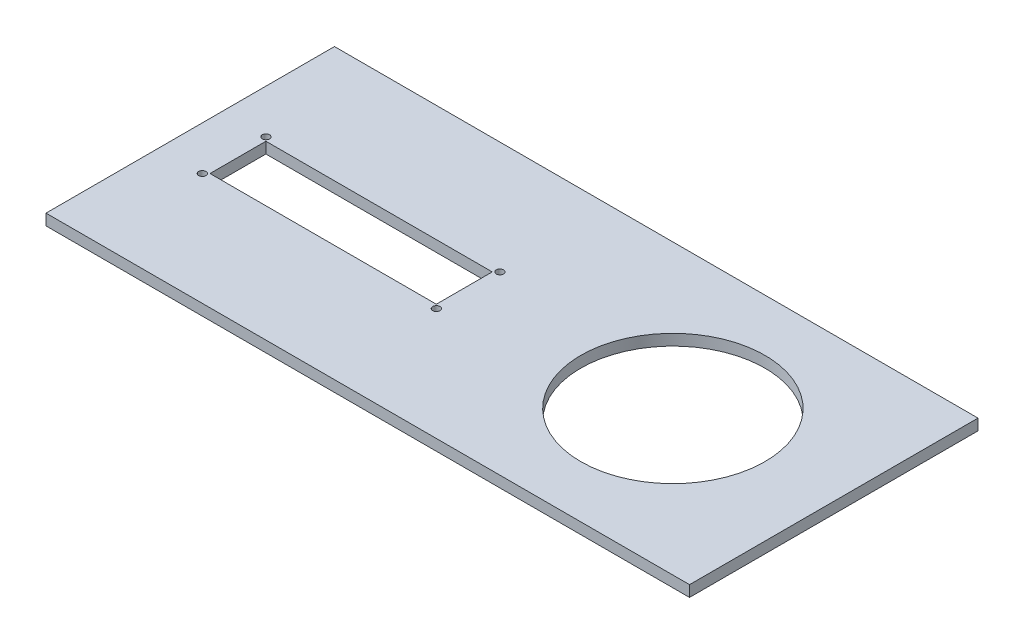
ISO-10303-21;
HEADER;
FILE_DESCRIPTION(('STEP AP214'),'2;1');
FILE_NAME('part.step','',(''),(''),'','','');
FILE_SCHEMA(('AUTOMOTIVE_DESIGN { 1 0 10303 214 1 1 1 1 }'));
ENDSEC;
DATA;
#1=APPLICATION_CONTEXT('core data for automotive mechanical design processes');
#2=APPLICATION_PROTOCOL_DEFINITION('international standard','automotive_design',2000,#1);
#3=PRODUCT_CONTEXT('',#1,'mechanical');
#4=PRODUCT('Part','Part','',(#3));
#5=PRODUCT_RELATED_PRODUCT_CATEGORY('part','',(#4));
#6=PRODUCT_DEFINITION_FORMATION('','',#4);
#7=PRODUCT_DEFINITION_CONTEXT('part definition',#1,'design');
#8=PRODUCT_DEFINITION('design','',#6,#7);
#9=PRODUCT_DEFINITION_SHAPE('','',#8);
#10=(LENGTH_UNIT() NAMED_UNIT(*) SI_UNIT(.MILLI.,.METRE.));
#11=(NAMED_UNIT(*) PLANE_ANGLE_UNIT() SI_UNIT($,.RADIAN.));
#12=(NAMED_UNIT(*) SI_UNIT($,.STERADIAN.) SOLID_ANGLE_UNIT());
#13=UNCERTAINTY_MEASURE_WITH_UNIT(LENGTH_MEASURE(1.E-05),#10,'distance_accuracy_value','');
#14=(GEOMETRIC_REPRESENTATION_CONTEXT(3) GLOBAL_UNCERTAINTY_ASSIGNED_CONTEXT((#13)) GLOBAL_UNIT_ASSIGNED_CONTEXT((#10,
#11,#12)) REPRESENTATION_CONTEXT('',''));
#15=CARTESIAN_POINT('',(0.,0.,0.));
#16=DIRECTION('',(0.,0.,1.));
#17=DIRECTION('',(1.,0.,0.));
#18=AXIS2_PLACEMENT_3D('',#15,#16,#17);
#19=CARTESIAN_POINT('',(184.15,6.35,82.55));
#20=DIRECTION('',(-1.,0.,0.));
#21=DIRECTION('',(0.,0.,1.));
#22=AXIS2_PLACEMENT_3D('',#19,#20,#21);
#23=PLANE('',#22);
#24=DIRECTION('',(0.,0.,-1.));
#25=VECTOR('',#24,1.);
#26=CARTESIAN_POINT('',(184.15,0.,82.55));
#27=LINE('',#26,#25);
#28=CARTESIAN_POINT('',(184.15,0.,82.55));
#29=VERTEX_POINT('',#28);
#30=CARTESIAN_POINT('',(184.15,0.,-82.55));
#31=VERTEX_POINT('',#30);
#32=EDGE_CURVE('E202',#29,#31,#27,.T.);
#33=ORIENTED_EDGE('',*,*,#32,.T.);
#34=DIRECTION('',(0.,-1.,0.));
#35=VECTOR('',#34,1.);
#36=CARTESIAN_POINT('',(184.15,6.35,-82.55));
#37=LINE('',#36,#35);
#38=CARTESIAN_POINT('',(184.15,6.35,-82.55));
#39=VERTEX_POINT('',#38);
#40=EDGE_CURVE('E12',#39,#31,#37,.T.);
#41=ORIENTED_EDGE('',*,*,#40,.F.);
#42=DIRECTION('',(0.,0.,-1.));
#43=VECTOR('',#42,1.);
#44=CARTESIAN_POINT('',(184.15,6.35,82.55));
#45=LINE('',#44,#43);
#46=CARTESIAN_POINT('',(184.15,6.35,82.55));
#47=VERTEX_POINT('',#46);
#48=EDGE_CURVE('E163',#47,#39,#45,.T.);
#49=ORIENTED_EDGE('',*,*,#48,.F.);
#50=DIRECTION('',(0.,-1.,0.));
#51=VECTOR('',#50,1.);
#52=CARTESIAN_POINT('',(184.15,6.35,82.55));
#53=LINE('',#52,#51);
#54=EDGE_CURVE('E221',#47,#29,#53,.T.);
#55=ORIENTED_EDGE('',*,*,#54,.T.);
#56=EDGE_LOOP('',(#33,#41,#49,#55));
#57=FACE_BOUND('',#56,.T.);
#58=ADVANCED_FACE('F38',(#57),#23,.F.);
#59=CARTESIAN_POINT('',(-184.15,6.35,-82.55));
#60=DIRECTION('',(0.,0.,1.));
#61=DIRECTION('',(1.,0.,0.));
#62=AXIS2_PLACEMENT_3D('',#59,#60,#61);
#63=PLANE('',#62);
#64=DIRECTION('',(-1.,0.,0.));
#65=VECTOR('',#64,1.);
#66=CARTESIAN_POINT('',(-184.15,0.,-82.55));
#67=LINE('',#66,#65);
#68=CARTESIAN_POINT('',(-184.15,0.,-82.55));
#69=VERTEX_POINT('',#68);
#70=EDGE_CURVE('E206',#31,#69,#67,.T.);
#71=ORIENTED_EDGE('',*,*,#70,.T.);
#72=DIRECTION('',(0.,-1.,0.));
#73=VECTOR('',#72,1.);
#74=CARTESIAN_POINT('',(-184.15,6.35,-82.55));
#75=LINE('',#74,#73);
#76=CARTESIAN_POINT('',(-184.15,6.35,-82.55));
#77=VERTEX_POINT('',#76);
#78=EDGE_CURVE('E45',#77,#69,#75,.T.);
#79=ORIENTED_EDGE('',*,*,#78,.F.);
#80=DIRECTION('',(-1.,0.,0.));
#81=VECTOR('',#80,1.);
#82=CARTESIAN_POINT('',(-184.15,6.35,-82.55));
#83=LINE('',#82,#81);
#84=EDGE_CURVE('E243',#39,#77,#83,.T.);
#85=ORIENTED_EDGE('',*,*,#84,.F.);
#86=ORIENTED_EDGE('',*,*,#40,.T.);
#87=EDGE_LOOP('',(#71,#79,#85,#86));
#88=FACE_BOUND('',#87,.T.);
#89=ADVANCED_FACE('F265',(#88),#63,.F.);
#90=CARTESIAN_POINT('',(-184.15,6.35,82.55));
#91=DIRECTION('',(1.,0.,0.));
#92=DIRECTION('',(0.,0.,-1.));
#93=AXIS2_PLACEMENT_3D('',#90,#91,#92);
#94=PLANE('',#93);
#95=DIRECTION('',(0.,0.,1.));
#96=VECTOR('',#95,1.);
#97=CARTESIAN_POINT('',(-184.15,0.,82.55));
#98=LINE('',#97,#96);
#99=CARTESIAN_POINT('',(-184.15,0.,82.55));
#100=VERTEX_POINT('',#99);
#101=EDGE_CURVE('E212',#69,#100,#98,.T.);
#102=ORIENTED_EDGE('',*,*,#101,.T.);
#103=DIRECTION('',(0.,-1.,0.));
#104=VECTOR('',#103,1.);
#105=CARTESIAN_POINT('',(-184.15,6.35,82.55));
#106=LINE('',#105,#104);
#107=CARTESIAN_POINT('',(-184.15,6.35,82.55));
#108=VERTEX_POINT('',#107);
#109=EDGE_CURVE('E223',#108,#100,#106,.T.);
#110=ORIENTED_EDGE('',*,*,#109,.F.);
#111=DIRECTION('',(0.,0.,1.));
#112=VECTOR('',#111,1.);
#113=CARTESIAN_POINT('',(-184.15,6.35,82.55));
#114=LINE('',#113,#112);
#115=EDGE_CURVE('E232',#77,#108,#114,.T.);
#116=ORIENTED_EDGE('',*,*,#115,.F.);
#117=ORIENTED_EDGE('',*,*,#78,.T.);
#118=EDGE_LOOP('',(#102,#110,#116,#117));
#119=FACE_BOUND('',#118,.T.);
#120=ADVANCED_FACE('F230',(#119),#94,.F.);
#121=CARTESIAN_POINT('',(-184.15,6.35,82.55));
#122=DIRECTION('',(0.,0.,-1.));
#123=DIRECTION('',(-1.,0.,0.));
#124=AXIS2_PLACEMENT_3D('',#121,#122,#123);
#125=PLANE('',#124);
#126=DIRECTION('',(1.,0.,0.));
#127=VECTOR('',#126,1.);
#128=CARTESIAN_POINT('',(-184.15,0.,82.55));
#129=LINE('',#128,#127);
#130=EDGE_CURVE('E219',#100,#29,#129,.T.);
#131=ORIENTED_EDGE('',*,*,#130,.T.);
#132=ORIENTED_EDGE('',*,*,#54,.F.);
#133=DIRECTION('',(1.,0.,0.));
#134=VECTOR('',#133,1.);
#135=CARTESIAN_POINT('',(-184.15,6.35,82.55));
#136=LINE('',#135,#134);
#137=EDGE_CURVE('E214',#108,#47,#136,.T.);
#138=ORIENTED_EDGE('',*,*,#137,.F.);
#139=ORIENTED_EDGE('',*,*,#109,.T.);
#140=EDGE_LOOP('',(#131,#132,#138,#139));
#141=FACE_BOUND('',#140,.T.);
#142=ADVANCED_FACE('F238',(#141),#125,.F.);
#143=CARTESIAN_POINT('',(0.,6.35,0.));
#144=DIRECTION('',(0.,-1.,0.));
#145=DIRECTION('',(0.,0.,-1.));
#146=AXIS2_PLACEMENT_3D('',#143,#144,#145);
#147=PLANE('',#146);
#148=CARTESIAN_POINT('',(92.075,6.35,0.));
#149=DIRECTION('',(0.,1.,0.));
#150=DIRECTION('',(0.,0.,1.));
#151=AXIS2_PLACEMENT_3D('',#148,#149,#150);
#152=CIRCLE('',#151,52.705);
#153=CARTESIAN_POINT('',(92.075,6.35,52.705));
#154=VERTEX_POINT('',#153);
#155=EDGE_CURVE('E151',#154,#154,#152,.T.);
#156=ORIENTED_EDGE('',*,*,#155,.F.);
#157=EDGE_LOOP('',(#156));
#158=FACE_BOUND('',#157,.T.);
#159=CARTESIAN_POINT('',(-25.1206,6.35,18.1864));
#160=DIRECTION('',(0.,1.,0.));
#161=DIRECTION('',(0.,0.,1.));
#162=AXIS2_PLACEMENT_3D('',#159,#160,#161);
#163=CIRCLE('',#162,2.08280000000001);
#164=CARTESIAN_POINT('',(-25.1206,6.35,20.2692));
#165=VERTEX_POINT('',#164);
#166=EDGE_CURVE('E187',#165,#165,#163,.T.);
#167=ORIENTED_EDGE('',*,*,#166,.F.);
#168=EDGE_LOOP('',(#167));
#169=FACE_BOUND('',#168,.T.);
#170=DIRECTION('',(-1.,0.,0.));
#171=VECTOR('',#170,1.);
#172=CARTESIAN_POINT('',(-156.845,6.35,-16.002));
#173=LINE('',#172,#171);
#174=CARTESIAN_POINT('',(-27.305,6.35,-16.002));
#175=VERTEX_POINT('',#174);
#176=CARTESIAN_POINT('',(-156.845,6.35,-16.002));
#177=VERTEX_POINT('',#176);
#178=EDGE_CURVE('E136',#175,#177,#173,.T.);
#179=ORIENTED_EDGE('',*,*,#178,.F.);
#180=DIRECTION('',(0.,0.,-1.));
#181=VECTOR('',#180,1.);
#182=CARTESIAN_POINT('',(-27.305,6.35,-16.002));
#183=LINE('',#182,#181);
#184=CARTESIAN_POINT('',(-27.305,6.35,16.002));
#185=VERTEX_POINT('',#184);
#186=EDGE_CURVE('E52',#185,#175,#183,.T.);
#187=ORIENTED_EDGE('',*,*,#186,.F.);
#188=DIRECTION('',(1.,0.,0.));
#189=VECTOR('',#188,1.);
#190=CARTESIAN_POINT('',(-156.845,6.35,16.002));
#191=LINE('',#190,#189);
#192=CARTESIAN_POINT('',(-156.845,6.35,16.002));
#193=VERTEX_POINT('',#192);
#194=EDGE_CURVE('E120',#193,#185,#191,.T.);
#195=ORIENTED_EDGE('',*,*,#194,.F.);
#196=DIRECTION('',(0.,0.,1.));
#197=VECTOR('',#196,1.);
#198=CARTESIAN_POINT('',(-156.845,6.35,-16.002));
#199=LINE('',#198,#197);
#200=EDGE_CURVE('E124',#177,#193,#199,.T.);
#201=ORIENTED_EDGE('',*,*,#200,.F.);
#202=EDGE_LOOP('',(#179,#187,#195,#201));
#203=FACE_BOUND('',#202,.T.);
#204=CARTESIAN_POINT('',(-159.0294,6.35,-18.1864));
#205=DIRECTION('',(0.,1.,0.));
#206=DIRECTION('',(0.,0.,1.));
#207=AXIS2_PLACEMENT_3D('',#204,#205,#206);
#208=CIRCLE('',#207,2.08279999999996);
#209=CARTESIAN_POINT('',(-159.0294,6.35,-16.1036));
#210=VERTEX_POINT('',#209);
#211=EDGE_CURVE('E157',#210,#210,#208,.T.);
#212=ORIENTED_EDGE('',*,*,#211,.F.);
#213=EDGE_LOOP('',(#212));
#214=FACE_BOUND('',#213,.T.);
#215=CARTESIAN_POINT('',(-159.0294,6.35,18.1864));
#216=DIRECTION('',(0.,1.,0.));
#217=DIRECTION('',(0.,0.,-1.));
#218=AXIS2_PLACEMENT_3D('',#215,#216,#217);
#219=CIRCLE('',#218,2.08279999999996);
#220=CARTESIAN_POINT('',(-159.0294,6.35,16.1036000000001));
#221=VERTEX_POINT('',#220);
#222=EDGE_CURVE('E170',#221,#221,#219,.T.);
#223=ORIENTED_EDGE('',*,*,#222,.F.);
#224=EDGE_LOOP('',(#223));
#225=FACE_BOUND('',#224,.T.);
#226=CARTESIAN_POINT('',(-25.1206,6.35,-18.1864));
#227=DIRECTION('',(0.,1.,0.));
#228=DIRECTION('',(0.,0.,-1.));
#229=AXIS2_PLACEMENT_3D('',#226,#227,#228);
#230=CIRCLE('',#229,2.08280000000002);
#231=CARTESIAN_POINT('',(-25.1206,6.35,-20.2692));
#232=VERTEX_POINT('',#231);
#233=EDGE_CURVE('E127',#232,#232,#230,.T.);
#234=ORIENTED_EDGE('',*,*,#233,.F.);
#235=EDGE_LOOP('',(#234));
#236=FACE_BOUND('',#235,.T.);
#237=ORIENTED_EDGE('',*,*,#48,.T.);
#238=ORIENTED_EDGE('',*,*,#84,.T.);
#239=ORIENTED_EDGE('',*,*,#115,.T.);
#240=ORIENTED_EDGE('',*,*,#137,.T.);
#241=EDGE_LOOP('',(#237,#238,#239,#240));
#242=FACE_BOUND('',#241,.T.);
#243=ADVANCED_FACE('F250',(#158,#169,#203,#214,#225,#236,#242),#147,.F.);
#244=CARTESIAN_POINT('',(0.,0.,0.));
#245=DIRECTION('',(0.,-1.,0.));
#246=DIRECTION('',(0.,0.,-1.));
#247=AXIS2_PLACEMENT_3D('',#244,#245,#246);
#248=PLANE('',#247);
#249=CARTESIAN_POINT('',(92.075,0.,0.));
#250=DIRECTION('',(0.,1.,0.));
#251=DIRECTION('',(0.,0.,1.));
#252=AXIS2_PLACEMENT_3D('',#249,#250,#251);
#253=CIRCLE('',#252,52.705);
#254=CARTESIAN_POINT('',(92.075,0.,52.705));
#255=VERTEX_POINT('',#254);
#256=EDGE_CURVE('E200',#255,#255,#253,.T.);
#257=ORIENTED_EDGE('',*,*,#256,.T.);
#258=EDGE_LOOP('',(#257));
#259=FACE_BOUND('',#258,.T.);
#260=CARTESIAN_POINT('',(-25.1206,0.,18.1864));
#261=DIRECTION('',(0.,1.,0.));
#262=DIRECTION('',(0.,0.,1.));
#263=AXIS2_PLACEMENT_3D('',#260,#261,#262);
#264=CIRCLE('',#263,2.08280000000001);
#265=CARTESIAN_POINT('',(-25.1206,0.,20.2692));
#266=VERTEX_POINT('',#265);
#267=EDGE_CURVE('E182',#266,#266,#264,.T.);
#268=ORIENTED_EDGE('',*,*,#267,.T.);
#269=EDGE_LOOP('',(#268));
#270=FACE_BOUND('',#269,.T.);
#271=DIRECTION('',(0.,0.,-1.));
#272=VECTOR('',#271,1.);
#273=CARTESIAN_POINT('',(-27.305,0.,-16.002));
#274=LINE('',#273,#272);
#275=CARTESIAN_POINT('',(-27.305,0.,16.002));
#276=VERTEX_POINT('',#275);
#277=CARTESIAN_POINT('',(-27.305,0.,-16.002));
#278=VERTEX_POINT('',#277);
#279=EDGE_CURVE('E104',#276,#278,#274,.T.);
#280=ORIENTED_EDGE('',*,*,#279,.T.);
#281=DIRECTION('',(-1.,0.,0.));
#282=VECTOR('',#281,1.);
#283=CARTESIAN_POINT('',(-156.845,0.,-16.002));
#284=LINE('',#283,#282);
#285=CARTESIAN_POINT('',(-156.845,0.,-16.002));
#286=VERTEX_POINT('',#285);
#287=EDGE_CURVE('E113',#278,#286,#284,.T.);
#288=ORIENTED_EDGE('',*,*,#287,.T.);
#289=DIRECTION('',(0.,0.,1.));
#290=VECTOR('',#289,1.);
#291=CARTESIAN_POINT('',(-156.845,0.,-16.002));
#292=LINE('',#291,#290);
#293=CARTESIAN_POINT('',(-156.845,0.,16.002));
#294=VERTEX_POINT('',#293);
#295=EDGE_CURVE('E60',#286,#294,#292,.T.);
#296=ORIENTED_EDGE('',*,*,#295,.T.);
#297=DIRECTION('',(1.,0.,0.));
#298=VECTOR('',#297,1.);
#299=CARTESIAN_POINT('',(-156.845,0.,16.002));
#300=LINE('',#299,#298);
#301=EDGE_CURVE('E110',#294,#276,#300,.T.);
#302=ORIENTED_EDGE('',*,*,#301,.T.);
#303=EDGE_LOOP('',(#280,#288,#296,#302));
#304=FACE_BOUND('',#303,.T.);
#305=CARTESIAN_POINT('',(-159.0294,0.,-18.1864));
#306=DIRECTION('',(0.,1.,0.));
#307=DIRECTION('',(0.,0.,1.));
#308=AXIS2_PLACEMENT_3D('',#305,#306,#307);
#309=CIRCLE('',#308,2.08279999999996);
#310=CARTESIAN_POINT('',(-159.0294,0.,-16.1036));
#311=VERTEX_POINT('',#310);
#312=EDGE_CURVE('E137',#311,#311,#309,.T.);
#313=ORIENTED_EDGE('',*,*,#312,.T.);
#314=EDGE_LOOP('',(#313));
#315=FACE_BOUND('',#314,.T.);
#316=CARTESIAN_POINT('',(-159.0294,0.,18.1864));
#317=DIRECTION('',(0.,1.,0.));
#318=DIRECTION('',(0.,0.,-1.));
#319=AXIS2_PLACEMENT_3D('',#316,#317,#318);
#320=CIRCLE('',#319,2.08279999999996);
#321=CARTESIAN_POINT('',(-159.0294,0.,16.1036000000001));
#322=VERTEX_POINT('',#321);
#323=EDGE_CURVE('E162',#322,#322,#320,.T.);
#324=ORIENTED_EDGE('',*,*,#323,.T.);
#325=EDGE_LOOP('',(#324));
#326=FACE_BOUND('',#325,.T.);
#327=CARTESIAN_POINT('',(-25.1206,0.,-18.1864));
#328=DIRECTION('',(0.,1.,0.));
#329=DIRECTION('',(0.,0.,-1.));
#330=AXIS2_PLACEMENT_3D('',#327,#328,#329);
#331=CIRCLE('',#330,2.08280000000002);
#332=CARTESIAN_POINT('',(-25.1206,0.,-20.2692));
#333=VERTEX_POINT('',#332);
#334=EDGE_CURVE('E175',#333,#333,#331,.T.);
#335=ORIENTED_EDGE('',*,*,#334,.T.);
#336=EDGE_LOOP('',(#335));
#337=FACE_BOUND('',#336,.T.);
#338=ORIENTED_EDGE('',*,*,#32,.F.);
#339=ORIENTED_EDGE('',*,*,#130,.F.);
#340=ORIENTED_EDGE('',*,*,#101,.F.);
#341=ORIENTED_EDGE('',*,*,#70,.F.);
#342=EDGE_LOOP('',(#338,#339,#340,#341));
#343=FACE_BOUND('',#342,.T.);
#344=ADVANCED_FACE('F117',(#259,#270,#304,#315,#326,#337,#343),#248,.T.);
#345=CARTESIAN_POINT('',(-25.1206,0.,-18.1864));
#346=DIRECTION('',(0.,1.,0.));
#347=DIRECTION('',(0.,0.,1.));
#348=AXIS2_PLACEMENT_3D('',#345,#346,#347);
#349=CYLINDRICAL_SURFACE('',#348,2.08280000000002);
#350=ORIENTED_EDGE('',*,*,#334,.F.);
#351=EDGE_LOOP('',(#350));
#352=FACE_BOUND('',#351,.T.);
#353=ORIENTED_EDGE('',*,*,#233,.T.);
#354=EDGE_LOOP('',(#353));
#355=FACE_BOUND('',#354,.T.);
#356=ADVANCED_FACE('F258',(#352,#355),#349,.F.);
#357=CARTESIAN_POINT('',(-159.0294,0.,18.1864));
#358=DIRECTION('',(0.,1.,0.));
#359=DIRECTION('',(0.,0.,1.));
#360=AXIS2_PLACEMENT_3D('',#357,#358,#359);
#361=CYLINDRICAL_SURFACE('',#360,2.08279999999996);
#362=ORIENTED_EDGE('',*,*,#323,.F.);
#363=EDGE_LOOP('',(#362));
#364=FACE_BOUND('',#363,.T.);
#365=ORIENTED_EDGE('',*,*,#222,.T.);
#366=EDGE_LOOP('',(#365));
#367=FACE_BOUND('',#366,.T.);
#368=ADVANCED_FACE('F298',(#364,#367),#361,.F.);
#369=CARTESIAN_POINT('',(-159.0294,0.,-18.1864));
#370=DIRECTION('',(0.,1.,0.));
#371=DIRECTION('',(0.,0.,1.));
#372=AXIS2_PLACEMENT_3D('',#369,#370,#371);
#373=CYLINDRICAL_SURFACE('',#372,2.08279999999996);
#374=ORIENTED_EDGE('',*,*,#312,.F.);
#375=EDGE_LOOP('',(#374));
#376=FACE_BOUND('',#375,.T.);
#377=ORIENTED_EDGE('',*,*,#211,.T.);
#378=EDGE_LOOP('',(#377));
#379=FACE_BOUND('',#378,.T.);
#380=ADVANCED_FACE('F308',(#376,#379),#373,.F.);
#381=CARTESIAN_POINT('',(-27.305,0.,-16.002));
#382=DIRECTION('',(1.,0.,0.));
#383=DIRECTION('',(0.,0.,-1.));
#384=AXIS2_PLACEMENT_3D('',#381,#382,#383);
#385=PLANE('',#384);
#386=ORIENTED_EDGE('',*,*,#186,.T.);
#387=DIRECTION('',(0.,1.,0.));
#388=VECTOR('',#387,1.);
#389=CARTESIAN_POINT('',(-27.305,0.,-16.002));
#390=LINE('',#389,#388);
#391=EDGE_CURVE('E100',#278,#175,#390,.T.);
#392=ORIENTED_EDGE('',*,*,#391,.F.);
#393=ORIENTED_EDGE('',*,*,#279,.F.);
#394=DIRECTION('',(0.,1.,0.));
#395=VECTOR('',#394,1.);
#396=CARTESIAN_POINT('',(-27.305,0.,16.002));
#397=LINE('',#396,#395);
#398=EDGE_CURVE('E149',#276,#185,#397,.T.);
#399=ORIENTED_EDGE('',*,*,#398,.T.);
#400=EDGE_LOOP('',(#386,#392,#393,#399));
#401=FACE_BOUND('',#400,.T.);
#402=ADVANCED_FACE('F102',(#401),#385,.F.);
#403=CARTESIAN_POINT('',(-156.845,0.,16.002));
#404=DIRECTION('',(0.,0.,1.));
#405=DIRECTION('',(1.,0.,0.));
#406=AXIS2_PLACEMENT_3D('',#403,#404,#405);
#407=PLANE('',#406);
#408=ORIENTED_EDGE('',*,*,#194,.T.);
#409=ORIENTED_EDGE('',*,*,#398,.F.);
#410=ORIENTED_EDGE('',*,*,#301,.F.);
#411=DIRECTION('',(0.,1.,0.));
#412=VECTOR('',#411,1.);
#413=CARTESIAN_POINT('',(-156.845,0.,16.002));
#414=LINE('',#413,#412);
#415=EDGE_CURVE('E152',#294,#193,#414,.T.);
#416=ORIENTED_EDGE('',*,*,#415,.T.);
#417=EDGE_LOOP('',(#408,#409,#410,#416));
#418=FACE_BOUND('',#417,.T.);
#419=ADVANCED_FACE('F326',(#418),#407,.F.);
#420=CARTESIAN_POINT('',(-156.845,0.,-16.002));
#421=DIRECTION('',(-1.,0.,0.));
#422=DIRECTION('',(0.,0.,1.));
#423=AXIS2_PLACEMENT_3D('',#420,#421,#422);
#424=PLANE('',#423);
#425=ORIENTED_EDGE('',*,*,#200,.T.);
#426=ORIENTED_EDGE('',*,*,#415,.F.);
#427=ORIENTED_EDGE('',*,*,#295,.F.);
#428=DIRECTION('',(0.,1.,0.));
#429=VECTOR('',#428,1.);
#430=CARTESIAN_POINT('',(-156.845,0.,-16.002));
#431=LINE('',#430,#429);
#432=EDGE_CURVE('E109',#286,#177,#431,.T.);
#433=ORIENTED_EDGE('',*,*,#432,.T.);
#434=EDGE_LOOP('',(#425,#426,#427,#433));
#435=FACE_BOUND('',#434,.T.);
#436=ADVANCED_FACE('F335',(#435),#424,.F.);
#437=CARTESIAN_POINT('',(-156.845,0.,-16.002));
#438=DIRECTION('',(0.,0.,-1.));
#439=DIRECTION('',(-1.,0.,0.));
#440=AXIS2_PLACEMENT_3D('',#437,#438,#439);
#441=PLANE('',#440);
#442=ORIENTED_EDGE('',*,*,#178,.T.);
#443=ORIENTED_EDGE('',*,*,#432,.F.);
#444=ORIENTED_EDGE('',*,*,#287,.F.);
#445=ORIENTED_EDGE('',*,*,#391,.T.);
#446=EDGE_LOOP('',(#442,#443,#444,#445));
#447=FACE_BOUND('',#446,.T.);
#448=ADVANCED_FACE('F114',(#447),#441,.F.);
#449=CARTESIAN_POINT('',(-25.1206,0.,18.1864));
#450=DIRECTION('',(0.,1.,0.));
#451=DIRECTION('',(0.,0.,1.));
#452=AXIS2_PLACEMENT_3D('',#449,#450,#451);
#453=CYLINDRICAL_SURFACE('',#452,2.08280000000001);
#454=ORIENTED_EDGE('',*,*,#267,.F.);
#455=EDGE_LOOP('',(#454));
#456=FACE_BOUND('',#455,.T.);
#457=ORIENTED_EDGE('',*,*,#166,.T.);
#458=EDGE_LOOP('',(#457));
#459=FACE_BOUND('',#458,.T.);
#460=ADVANCED_FACE('F353',(#456,#459),#453,.F.);
#461=CARTESIAN_POINT('',(92.075,0.,0.));
#462=DIRECTION('',(0.,1.,0.));
#463=DIRECTION('',(0.,0.,1.));
#464=AXIS2_PLACEMENT_3D('',#461,#462,#463);
#465=CYLINDRICAL_SURFACE('',#464,52.705);
#466=ORIENTED_EDGE('',*,*,#256,.F.);
#467=EDGE_LOOP('',(#466));
#468=FACE_BOUND('',#467,.T.);
#469=ORIENTED_EDGE('',*,*,#155,.T.);
#470=EDGE_LOOP('',(#469));
#471=FACE_BOUND('',#470,.T.);
#472=ADVANCED_FACE('F362',(#468,#471),#465,.F.);
#473=CLOSED_SHELL('',(#58,#89,#120,#142,#243,#344,#356,#368,#380,#402,#419,#436,#448,#460,#472));
#474=MANIFOLD_SOLID_BREP('B2',#473);
#475=ADVANCED_BREP_SHAPE_REPRESENTATION('',(#18,#474),#14);
#476=SHAPE_DEFINITION_REPRESENTATION(#9,#475);
ENDSEC;
END-ISO-10303-21;
